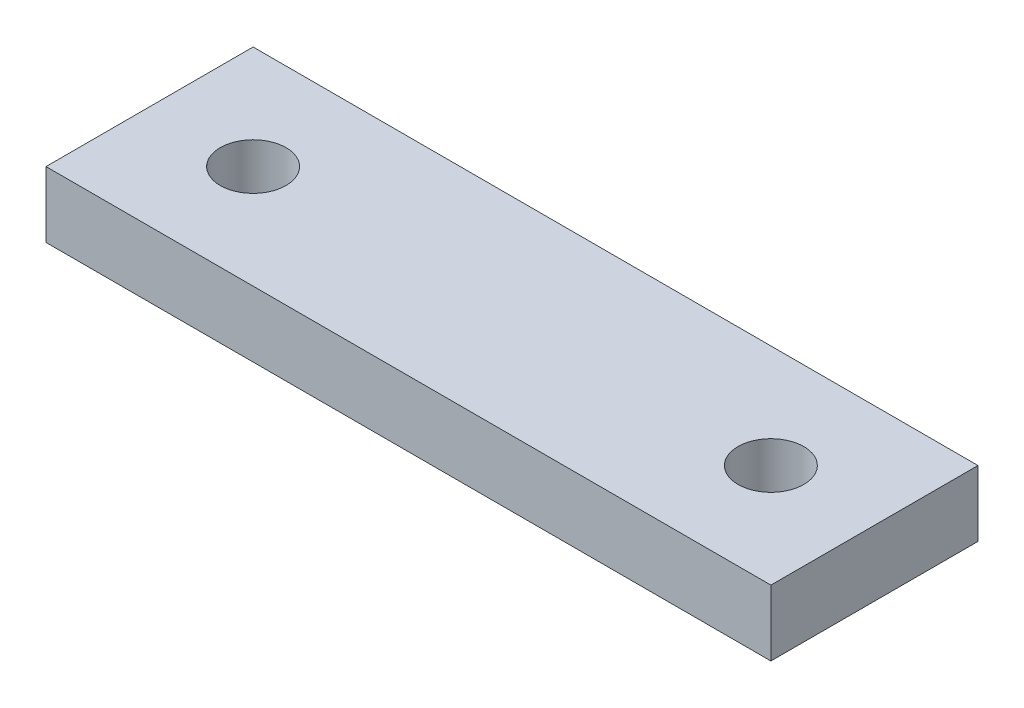
ISO-10303-21;
HEADER;
FILE_DESCRIPTION(('STEP AP214'),'2;1');
FILE_NAME('part.step','',(''),(''),'','','');
FILE_SCHEMA(('AUTOMOTIVE_DESIGN { 1 0 10303 214 1 1 1 1 }'));
ENDSEC;
DATA;
#1=APPLICATION_CONTEXT('core data for automotive mechanical design processes');
#2=APPLICATION_PROTOCOL_DEFINITION('international standard','automotive_design',2000,#1);
#3=PRODUCT_CONTEXT('',#1,'mechanical');
#4=PRODUCT('Part','Part','',(#3));
#5=PRODUCT_RELATED_PRODUCT_CATEGORY('part','',(#4));
#6=PRODUCT_DEFINITION_FORMATION('','',#4);
#7=PRODUCT_DEFINITION_CONTEXT('part definition',#1,'design');
#8=PRODUCT_DEFINITION('design','',#6,#7);
#9=PRODUCT_DEFINITION_SHAPE('','',#8);
#10=(LENGTH_UNIT() NAMED_UNIT(*) SI_UNIT(.MILLI.,.METRE.));
#11=(NAMED_UNIT(*) PLANE_ANGLE_UNIT() SI_UNIT($,.RADIAN.));
#12=(NAMED_UNIT(*) SI_UNIT($,.STERADIAN.) SOLID_ANGLE_UNIT());
#13=UNCERTAINTY_MEASURE_WITH_UNIT(LENGTH_MEASURE(1.E-05),#10,'distance_accuracy_value','');
#14=(GEOMETRIC_REPRESENTATION_CONTEXT(3) GLOBAL_UNCERTAINTY_ASSIGNED_CONTEXT((#13)) GLOBAL_UNIT_ASSIGNED_CONTEXT((#10,
#11,#12)) REPRESENTATION_CONTEXT('',''));
#15=CARTESIAN_POINT('',(0.,0.,0.));
#16=DIRECTION('',(0.,0.,1.));
#17=DIRECTION('',(1.,0.,0.));
#18=AXIS2_PLACEMENT_3D('',#15,#16,#17);
#19=CARTESIAN_POINT('',(-35.,6.35,-10.));
#20=DIRECTION('',(1.,0.,0.));
#21=DIRECTION('',(0.,0.,-1.));
#22=AXIS2_PLACEMENT_3D('',#19,#20,#21);
#23=PLANE('',#22);
#24=DIRECTION('',(0.,0.,1.));
#25=VECTOR('',#24,1.);
#26=CARTESIAN_POINT('',(-35.,0.,-10.));
#27=LINE('',#26,#25);
#28=CARTESIAN_POINT('',(-35.,0.,-10.));
#29=VERTEX_POINT('',#28);
#30=CARTESIAN_POINT('',(-35.,0.,10.));
#31=VERTEX_POINT('',#30);
#32=EDGE_CURVE('E95',#29,#31,#27,.T.);
#33=ORIENTED_EDGE('',*,*,#32,.T.);
#34=DIRECTION('',(0.,-1.,0.));
#35=VECTOR('',#34,1.);
#36=CARTESIAN_POINT('',(-35.,6.35,10.));
#37=LINE('',#36,#35);
#38=CARTESIAN_POINT('',(-35.,6.35,10.));
#39=VERTEX_POINT('',#38);
#40=EDGE_CURVE('E11',#39,#31,#37,.T.);
#41=ORIENTED_EDGE('',*,*,#40,.F.);
#42=DIRECTION('',(0.,0.,1.));
#43=VECTOR('',#42,1.);
#44=CARTESIAN_POINT('',(-35.,6.35,-10.));
#45=LINE('',#44,#43);
#46=CARTESIAN_POINT('',(-35.,6.35,-10.));
#47=VERTEX_POINT('',#46);
#48=EDGE_CURVE('E83',#47,#39,#45,.T.);
#49=ORIENTED_EDGE('',*,*,#48,.F.);
#50=DIRECTION('',(0.,-1.,0.));
#51=VECTOR('',#50,1.);
#52=CARTESIAN_POINT('',(-35.,6.35,-10.));
#53=LINE('',#52,#51);
#54=EDGE_CURVE('E91',#47,#29,#53,.T.);
#55=ORIENTED_EDGE('',*,*,#54,.T.);
#56=EDGE_LOOP('',(#33,#41,#49,#55));
#57=FACE_BOUND('',#56,.T.);
#58=ADVANCED_FACE('F32',(#57),#23,.F.);
#59=CARTESIAN_POINT('',(-35.,6.35,10.));
#60=DIRECTION('',(0.,0.,-1.));
#61=DIRECTION('',(-1.,0.,0.));
#62=AXIS2_PLACEMENT_3D('',#59,#60,#61);
#63=PLANE('',#62);
#64=DIRECTION('',(1.,0.,0.));
#65=VECTOR('',#64,1.);
#66=CARTESIAN_POINT('',(-35.,0.,10.));
#67=LINE('',#66,#65);
#68=CARTESIAN_POINT('',(35.,0.,10.));
#69=VERTEX_POINT('',#68);
#70=EDGE_CURVE('E87',#31,#69,#67,.T.);
#71=ORIENTED_EDGE('',*,*,#70,.T.);
#72=DIRECTION('',(0.,-1.,0.));
#73=VECTOR('',#72,1.);
#74=CARTESIAN_POINT('',(35.,6.35,10.));
#75=LINE('',#74,#73);
#76=CARTESIAN_POINT('',(35.,6.35,10.));
#77=VERTEX_POINT('',#76);
#78=EDGE_CURVE('E40',#77,#69,#75,.T.);
#79=ORIENTED_EDGE('',*,*,#78,.F.);
#80=DIRECTION('',(1.,0.,0.));
#81=VECTOR('',#80,1.);
#82=CARTESIAN_POINT('',(-35.,6.35,10.));
#83=LINE('',#82,#81);
#84=EDGE_CURVE('E78',#39,#77,#83,.T.);
#85=ORIENTED_EDGE('',*,*,#84,.F.);
#86=ORIENTED_EDGE('',*,*,#40,.T.);
#87=EDGE_LOOP('',(#71,#79,#85,#86));
#88=FACE_BOUND('',#87,.T.);
#89=ADVANCED_FACE('F86',(#88),#63,.F.);
#90=CARTESIAN_POINT('',(35.,6.35,-10.));
#91=DIRECTION('',(-1.,0.,0.));
#92=DIRECTION('',(0.,0.,1.));
#93=AXIS2_PLACEMENT_3D('',#90,#91,#92);
#94=PLANE('',#93);
#95=DIRECTION('',(0.,0.,-1.));
#96=VECTOR('',#95,1.);
#97=CARTESIAN_POINT('',(35.,0.,-10.));
#98=LINE('',#97,#96);
#99=CARTESIAN_POINT('',(35.,0.,-10.));
#100=VERTEX_POINT('',#99);
#101=EDGE_CURVE('E65',#69,#100,#98,.T.);
#102=ORIENTED_EDGE('',*,*,#101,.T.);
#103=DIRECTION('',(0.,-1.,0.));
#104=VECTOR('',#103,1.);
#105=CARTESIAN_POINT('',(35.,6.35,-10.));
#106=LINE('',#105,#104);
#107=CARTESIAN_POINT('',(35.,6.35,-10.));
#108=VERTEX_POINT('',#107);
#109=EDGE_CURVE('E88',#108,#100,#106,.T.);
#110=ORIENTED_EDGE('',*,*,#109,.F.);
#111=DIRECTION('',(0.,0.,-1.));
#112=VECTOR('',#111,1.);
#113=CARTESIAN_POINT('',(35.,6.35,-10.));
#114=LINE('',#113,#112);
#115=EDGE_CURVE('E81',#77,#108,#114,.T.);
#116=ORIENTED_EDGE('',*,*,#115,.F.);
#117=ORIENTED_EDGE('',*,*,#78,.T.);
#118=EDGE_LOOP('',(#102,#110,#116,#117));
#119=FACE_BOUND('',#118,.T.);
#120=ADVANCED_FACE('F89',(#119),#94,.F.);
#121=CARTESIAN_POINT('',(-35.,6.35,-10.));
#122=DIRECTION('',(0.,0.,1.));
#123=DIRECTION('',(1.,0.,0.));
#124=AXIS2_PLACEMENT_3D('',#121,#122,#123);
#125=PLANE('',#124);
#126=DIRECTION('',(-1.,0.,0.));
#127=VECTOR('',#126,1.);
#128=CARTESIAN_POINT('',(-35.,0.,-10.));
#129=LINE('',#128,#127);
#130=EDGE_CURVE('E71',#100,#29,#129,.T.);
#131=ORIENTED_EDGE('',*,*,#130,.T.);
#132=ORIENTED_EDGE('',*,*,#54,.F.);
#133=DIRECTION('',(-1.,0.,0.));
#134=VECTOR('',#133,1.);
#135=CARTESIAN_POINT('',(-35.,6.35,-10.));
#136=LINE('',#135,#134);
#137=EDGE_CURVE('E48',#108,#47,#136,.T.);
#138=ORIENTED_EDGE('',*,*,#137,.F.);
#139=ORIENTED_EDGE('',*,*,#109,.T.);
#140=EDGE_LOOP('',(#131,#132,#138,#139));
#141=FACE_BOUND('',#140,.T.);
#142=ADVANCED_FACE('F103',(#141),#125,.F.);
#143=CARTESIAN_POINT('',(0.,6.35,0.));
#144=DIRECTION('',(0.,1.,0.));
#145=DIRECTION('',(0.,0.,1.));
#146=AXIS2_PLACEMENT_3D('',#143,#144,#145);
#147=PLANE('',#146);
#148=CARTESIAN_POINT('',(-25.,6.35,0.));
#149=DIRECTION('',(0.,1.,0.));
#150=DIRECTION('',(0.,0.,1.));
#151=AXIS2_PLACEMENT_3D('',#148,#149,#150);
#152=CIRCLE('',#151,3.175);
#153=CARTESIAN_POINT('',(-25.,6.35,3.175));
#154=VERTEX_POINT('',#153);
#155=EDGE_CURVE('E112',#154,#154,#152,.T.);
#156=ORIENTED_EDGE('',*,*,#155,.F.);
#157=EDGE_LOOP('',(#156));
#158=FACE_BOUND('',#157,.T.);
#159=CARTESIAN_POINT('',(25.,6.35,0.));
#160=DIRECTION('',(0.,1.,0.));
#161=DIRECTION('',(0.,0.,1.));
#162=AXIS2_PLACEMENT_3D('',#159,#160,#161);
#163=CIRCLE('',#162,3.175);
#164=CARTESIAN_POINT('',(25.,6.35,3.175));
#165=VERTEX_POINT('',#164);
#166=EDGE_CURVE('E113',#165,#165,#163,.T.);
#167=ORIENTED_EDGE('',*,*,#166,.F.);
#168=EDGE_LOOP('',(#167));
#169=FACE_BOUND('',#168,.T.);
#170=ORIENTED_EDGE('',*,*,#48,.T.);
#171=ORIENTED_EDGE('',*,*,#84,.T.);
#172=ORIENTED_EDGE('',*,*,#115,.T.);
#173=ORIENTED_EDGE('',*,*,#137,.T.);
#174=EDGE_LOOP('',(#170,#171,#172,#173));
#175=FACE_BOUND('',#174,.T.);
#176=ADVANCED_FACE('F79',(#158,#169,#175),#147,.T.);
#177=CARTESIAN_POINT('',(0.,0.,0.));
#178=DIRECTION('',(0.,1.,0.));
#179=DIRECTION('',(0.,0.,1.));
#180=AXIS2_PLACEMENT_3D('',#177,#178,#179);
#181=PLANE('',#180);
#182=CARTESIAN_POINT('',(-25.,0.,0.));
#183=DIRECTION('',(0.,1.,0.));
#184=DIRECTION('',(0.,0.,1.));
#185=AXIS2_PLACEMENT_3D('',#182,#183,#184);
#186=CIRCLE('',#185,3.175);
#187=CARTESIAN_POINT('',(-25.,0.,3.175));
#188=VERTEX_POINT('',#187);
#189=EDGE_CURVE('E98',#188,#188,#186,.F.);
#190=ORIENTED_EDGE('',*,*,#189,.F.);
#191=EDGE_LOOP('',(#190));
#192=FACE_BOUND('',#191,.T.);
#193=CARTESIAN_POINT('',(25.,0.,0.));
#194=DIRECTION('',(0.,1.,0.));
#195=DIRECTION('',(0.,0.,1.));
#196=AXIS2_PLACEMENT_3D('',#193,#194,#195);
#197=CIRCLE('',#196,3.175);
#198=CARTESIAN_POINT('',(25.,0.,3.175));
#199=VERTEX_POINT('',#198);
#200=EDGE_CURVE('E109',#199,#199,#197,.F.);
#201=ORIENTED_EDGE('',*,*,#200,.F.);
#202=EDGE_LOOP('',(#201));
#203=FACE_BOUND('',#202,.T.);
#204=ORIENTED_EDGE('',*,*,#32,.F.);
#205=ORIENTED_EDGE('',*,*,#130,.F.);
#206=ORIENTED_EDGE('',*,*,#101,.F.);
#207=ORIENTED_EDGE('',*,*,#70,.F.);
#208=EDGE_LOOP('',(#204,#205,#206,#207));
#209=FACE_BOUND('',#208,.T.);
#210=ADVANCED_FACE('F106',(#192,#203,#209),#181,.F.);
#211=CARTESIAN_POINT('',(25.,-8.98025612106916,0.));
#212=DIRECTION('',(0.,1.,0.));
#213=DIRECTION('',(0.,0.,1.));
#214=AXIS2_PLACEMENT_3D('',#211,#212,#213);
#215=CYLINDRICAL_SURFACE('',#214,3.175);
#216=CARTESIAN_POINT('',(25.,0.,3.175));
#217=CARTESIAN_POINT('',(25.,0.0661458333333318,3.175));
#218=CARTESIAN_POINT('',(25.,0.132291666666665,3.175));
#219=CARTESIAN_POINT('',(25.,0.264583333333332,3.175));
#220=CARTESIAN_POINT('',(25.,0.330729166666665,3.175));
#221=CARTESIAN_POINT('',(25.,0.463020833333331,3.175));
#222=CARTESIAN_POINT('',(25.,0.529166666666665,3.175));
#223=CARTESIAN_POINT('',(25.,0.661458333333332,3.175));
#224=CARTESIAN_POINT('',(25.,0.727604166666665,3.175));
#225=CARTESIAN_POINT('',(25.,0.859895833333331,3.175));
#226=CARTESIAN_POINT('',(25.,0.926041666666665,3.175));
#227=CARTESIAN_POINT('',(25.,1.05833333333333,3.175));
#228=CARTESIAN_POINT('',(25.,1.12447916666667,3.175));
#229=CARTESIAN_POINT('',(25.,1.25677083333333,3.175));
#230=CARTESIAN_POINT('',(25.,1.32291666666666,3.175));
#231=CARTESIAN_POINT('',(25.,1.45520833333333,3.175));
#232=CARTESIAN_POINT('',(25.,1.52135416666667,3.175));
#233=CARTESIAN_POINT('',(25.,1.65364583333333,3.175));
#234=CARTESIAN_POINT('',(25.,1.71979166666667,3.175));
#235=CARTESIAN_POINT('',(25.,1.85208333333333,3.175));
#236=CARTESIAN_POINT('',(25.,1.91822916666667,3.175));
#237=CARTESIAN_POINT('',(25.,2.05052083333333,3.175));
#238=CARTESIAN_POINT('',(25.,2.11666666666667,3.175));
#239=CARTESIAN_POINT('',(25.,2.24895833333333,3.175));
#240=CARTESIAN_POINT('',(25.,2.31510416666667,3.175));
#241=CARTESIAN_POINT('',(25.,2.44739583333333,3.175));
#242=CARTESIAN_POINT('',(25.,2.51354166666667,3.175));
#243=CARTESIAN_POINT('',(25.,2.64583333333333,3.175));
#244=CARTESIAN_POINT('',(25.,2.71197916666667,3.175));
#245=CARTESIAN_POINT('',(25.,2.84427083333333,3.175));
#246=CARTESIAN_POINT('',(25.,2.91041666666667,3.175));
#247=CARTESIAN_POINT('',(25.,3.04270833333333,3.175));
#248=CARTESIAN_POINT('',(25.,3.10885416666667,3.175));
#249=CARTESIAN_POINT('',(25.,3.24114583333333,3.175));
#250=CARTESIAN_POINT('',(25.,3.30729166666667,3.175));
#251=CARTESIAN_POINT('',(25.,3.43958333333333,3.175));
#252=CARTESIAN_POINT('',(25.,3.50572916666667,3.175));
#253=CARTESIAN_POINT('',(25.,3.63802083333333,3.175));
#254=CARTESIAN_POINT('',(25.,3.70416666666667,3.175));
#255=CARTESIAN_POINT('',(25.,3.83645833333333,3.175));
#256=CARTESIAN_POINT('',(25.,3.90260416666667,3.175));
#257=CARTESIAN_POINT('',(25.,4.03489583333333,3.175));
#258=CARTESIAN_POINT('',(25.,4.10104166666667,3.175));
#259=CARTESIAN_POINT('',(25.,4.23333333333333,3.175));
#260=CARTESIAN_POINT('',(25.,4.29947916666667,3.175));
#261=CARTESIAN_POINT('',(25.,4.43177083333333,3.175));
#262=CARTESIAN_POINT('',(25.,4.49791666666667,3.175));
#263=CARTESIAN_POINT('',(25.,4.63020833333333,3.175));
#264=CARTESIAN_POINT('',(25.,4.69635416666667,3.175));
#265=CARTESIAN_POINT('',(25.,4.82864583333333,3.175));
#266=CARTESIAN_POINT('',(25.,4.89479166666667,3.175));
#267=CARTESIAN_POINT('',(25.,5.02708333333333,3.175));
#268=CARTESIAN_POINT('',(25.,5.09322916666667,3.175));
#269=CARTESIAN_POINT('',(25.,5.22552083333333,3.175));
#270=CARTESIAN_POINT('',(25.,5.29166666666667,3.175));
#271=CARTESIAN_POINT('',(25.,5.42395833333333,3.175));
#272=CARTESIAN_POINT('',(25.,5.49010416666667,3.175));
#273=CARTESIAN_POINT('',(25.,5.62239583333333,3.175));
#274=CARTESIAN_POINT('',(25.,5.68854166666667,3.175));
#275=CARTESIAN_POINT('',(25.,5.82083333333333,3.175));
#276=CARTESIAN_POINT('',(25.,5.88697916666667,3.175));
#277=CARTESIAN_POINT('',(25.,6.01927083333333,3.175));
#278=CARTESIAN_POINT('',(25.,6.08541666666667,3.175));
#279=CARTESIAN_POINT('',(25.,6.21770833333333,3.175));
#280=CARTESIAN_POINT('',(25.,6.28385416666667,3.175));
#281=CARTESIAN_POINT('',(25.,6.35,3.175));
#282=B_SPLINE_CURVE_WITH_KNOTS('',3,(#216,#217,#218,#219,#220,#221,#222,#223,#224,#225,#226,
#227,#228,#229,#230,#231,#232,#233,#234,#235,#236,#237,#238,#239,#240,#241,#242,#243,#244,#245,
#246,#247,#248,#249,#250,#251,#252,#253,#254,#255,#256,#257,#258,#259,#260,#261,#262,#263,#264,
#265,#266,#267,#268,#269,#270,#271,#272,#273,#274,#275,#276,#277,#278,#279,#280,#281),
.UNSPECIFIED.,.F.,.F.,(4,2,2,2,2,2,2,2,2,2,2,2,2,2,2,2,2,2,2,2,2,2,2,2,2,2,2,2,2,2,2,2,4),(0.,
0.198437500000001,0.396875,0.5953125,0.793749999999999,0.9921875,1.190625,1.3890625,1.5875,
1.7859375,1.984375,2.1828125,2.38125,2.5796875,2.778125,2.9765625,3.175,3.3734375,3.571875,
3.7703125,3.96875,4.1671875,4.365625,4.5640625,4.7625,4.9609375,5.159375,5.3578125,5.55625,
5.7546875,5.953125,6.1515625,6.35),.UNSPECIFIED.);
#283=EDGE_CURVE('BSEAM128',#199,#165,#282,.T.);
#284=ORIENTED_EDGE('',*,*,#200,.T.);
#285=ORIENTED_EDGE('',*,*,#166,.T.);
#286=ORIENTED_EDGE('',*,*,#283,.T.);
#287=ORIENTED_EDGE('',*,*,#283,.F.);
#288=EDGE_LOOP('',(#284,#286,#285,#287));
#289=FACE_BOUND('',#288,.T.);
#290=ADVANCED_FACE('F128',(#289),#215,.F.);
#291=CARTESIAN_POINT('',(-25.,-8.98025612106916,0.));
#292=DIRECTION('',(0.,1.,0.));
#293=DIRECTION('',(0.,0.,1.));
#294=AXIS2_PLACEMENT_3D('',#291,#292,#293);
#295=CYLINDRICAL_SURFACE('',#294,3.175);
#296=CARTESIAN_POINT('',(-25.,0.,3.175));
#297=CARTESIAN_POINT('',(-25.,0.0661458333333318,3.175));
#298=CARTESIAN_POINT('',(-25.,0.132291666666665,3.175));
#299=CARTESIAN_POINT('',(-25.,0.264583333333332,3.175));
#300=CARTESIAN_POINT('',(-25.,0.330729166666665,3.175));
#301=CARTESIAN_POINT('',(-25.,0.463020833333331,3.175));
#302=CARTESIAN_POINT('',(-25.,0.529166666666665,3.175));
#303=CARTESIAN_POINT('',(-25.,0.661458333333332,3.175));
#304=CARTESIAN_POINT('',(-25.,0.727604166666665,3.175));
#305=CARTESIAN_POINT('',(-25.,0.859895833333331,3.175));
#306=CARTESIAN_POINT('',(-25.,0.926041666666665,3.175));
#307=CARTESIAN_POINT('',(-25.,1.05833333333333,3.175));
#308=CARTESIAN_POINT('',(-25.,1.12447916666667,3.175));
#309=CARTESIAN_POINT('',(-25.,1.25677083333333,3.175));
#310=CARTESIAN_POINT('',(-25.,1.32291666666666,3.175));
#311=CARTESIAN_POINT('',(-25.,1.45520833333333,3.175));
#312=CARTESIAN_POINT('',(-25.,1.52135416666667,3.175));
#313=CARTESIAN_POINT('',(-25.,1.65364583333333,3.175));
#314=CARTESIAN_POINT('',(-25.,1.71979166666667,3.175));
#315=CARTESIAN_POINT('',(-25.,1.85208333333333,3.175));
#316=CARTESIAN_POINT('',(-25.,1.91822916666667,3.175));
#317=CARTESIAN_POINT('',(-25.,2.05052083333333,3.175));
#318=CARTESIAN_POINT('',(-25.,2.11666666666667,3.175));
#319=CARTESIAN_POINT('',(-25.,2.24895833333333,3.175));
#320=CARTESIAN_POINT('',(-25.,2.31510416666667,3.175));
#321=CARTESIAN_POINT('',(-25.,2.44739583333333,3.175));
#322=CARTESIAN_POINT('',(-25.,2.51354166666667,3.175));
#323=CARTESIAN_POINT('',(-25.,2.64583333333333,3.175));
#324=CARTESIAN_POINT('',(-25.,2.71197916666667,3.175));
#325=CARTESIAN_POINT('',(-25.,2.84427083333333,3.175));
#326=CARTESIAN_POINT('',(-25.,2.91041666666667,3.175));
#327=CARTESIAN_POINT('',(-25.,3.04270833333333,3.175));
#328=CARTESIAN_POINT('',(-25.,3.10885416666667,3.175));
#329=CARTESIAN_POINT('',(-25.,3.24114583333333,3.175));
#330=CARTESIAN_POINT('',(-25.,3.30729166666667,3.175));
#331=CARTESIAN_POINT('',(-25.,3.43958333333333,3.175));
#332=CARTESIAN_POINT('',(-25.,3.50572916666667,3.175));
#333=CARTESIAN_POINT('',(-25.,3.63802083333333,3.175));
#334=CARTESIAN_POINT('',(-25.,3.70416666666667,3.175));
#335=CARTESIAN_POINT('',(-25.,3.83645833333333,3.175));
#336=CARTESIAN_POINT('',(-25.,3.90260416666667,3.175));
#337=CARTESIAN_POINT('',(-25.,4.03489583333333,3.175));
#338=CARTESIAN_POINT('',(-25.,4.10104166666667,3.175));
#339=CARTESIAN_POINT('',(-25.,4.23333333333333,3.175));
#340=CARTESIAN_POINT('',(-25.,4.29947916666667,3.175));
#341=CARTESIAN_POINT('',(-25.,4.43177083333333,3.175));
#342=CARTESIAN_POINT('',(-25.,4.49791666666667,3.175));
#343=CARTESIAN_POINT('',(-25.,4.63020833333333,3.175));
#344=CARTESIAN_POINT('',(-25.,4.69635416666667,3.175));
#345=CARTESIAN_POINT('',(-25.,4.82864583333333,3.175));
#346=CARTESIAN_POINT('',(-25.,4.89479166666667,3.175));
#347=CARTESIAN_POINT('',(-25.,5.02708333333333,3.175));
#348=CARTESIAN_POINT('',(-25.,5.09322916666667,3.175));
#349=CARTESIAN_POINT('',(-25.,5.22552083333333,3.175));
#350=CARTESIAN_POINT('',(-25.,5.29166666666667,3.175));
#351=CARTESIAN_POINT('',(-25.,5.42395833333333,3.175));
#352=CARTESIAN_POINT('',(-25.,5.49010416666667,3.175));
#353=CARTESIAN_POINT('',(-25.,5.62239583333333,3.175));
#354=CARTESIAN_POINT('',(-25.,5.68854166666667,3.175));
#355=CARTESIAN_POINT('',(-25.,5.82083333333333,3.175));
#356=CARTESIAN_POINT('',(-25.,5.88697916666667,3.175));
#357=CARTESIAN_POINT('',(-25.,6.01927083333333,3.175));
#358=CARTESIAN_POINT('',(-25.,6.08541666666667,3.175));
#359=CARTESIAN_POINT('',(-25.,6.21770833333333,3.175));
#360=CARTESIAN_POINT('',(-25.,6.28385416666667,3.175));
#361=CARTESIAN_POINT('',(-25.,6.35,3.175));
#362=B_SPLINE_CURVE_WITH_KNOTS('',3,(#296,#297,#298,#299,#300,#301,#302,#303,#304,#305,#306,
#307,#308,#309,#310,#311,#312,#313,#314,#315,#316,#317,#318,#319,#320,#321,#322,#323,#324,#325,
#326,#327,#328,#329,#330,#331,#332,#333,#334,#335,#336,#337,#338,#339,#340,#341,#342,#343,#344,
#345,#346,#347,#348,#349,#350,#351,#352,#353,#354,#355,#356,#357,#358,#359,#360,#361),
.UNSPECIFIED.,.F.,.F.,(4,2,2,2,2,2,2,2,2,2,2,2,2,2,2,2,2,2,2,2,2,2,2,2,2,2,2,2,2,2,2,2,4),(0.,
0.198437500000001,0.396875,0.5953125,0.793749999999999,0.9921875,1.190625,1.3890625,1.5875,
1.7859375,1.984375,2.1828125,2.38125,2.5796875,2.778125,2.9765625,3.175,3.3734375,3.571875,
3.7703125,3.96875,4.1671875,4.365625,4.5640625,4.7625,4.9609375,5.159375,5.3578125,5.55625,
5.7546875,5.953125,6.1515625,6.35),.UNSPECIFIED.);
#363=EDGE_CURVE('BSEAM121',#188,#154,#362,.T.);
#364=ORIENTED_EDGE('',*,*,#189,.T.);
#365=ORIENTED_EDGE('',*,*,#155,.T.);
#366=ORIENTED_EDGE('',*,*,#363,.T.);
#367=ORIENTED_EDGE('',*,*,#363,.F.);
#368=EDGE_LOOP('',(#364,#366,#365,#367));
#369=FACE_BOUND('',#368,.T.);
#370=ADVANCED_FACE('F121',(#369),#295,.F.);
#371=CLOSED_SHELL('',(#58,#89,#120,#142,#176,#210,#290,#370));
#372=MANIFOLD_SOLID_BREP('B2',#371);
#373=ADVANCED_BREP_SHAPE_REPRESENTATION('',(#18,#372),#14);
#374=SHAPE_DEFINITION_REPRESENTATION(#9,#373);
ENDSEC;
END-ISO-10303-21;
